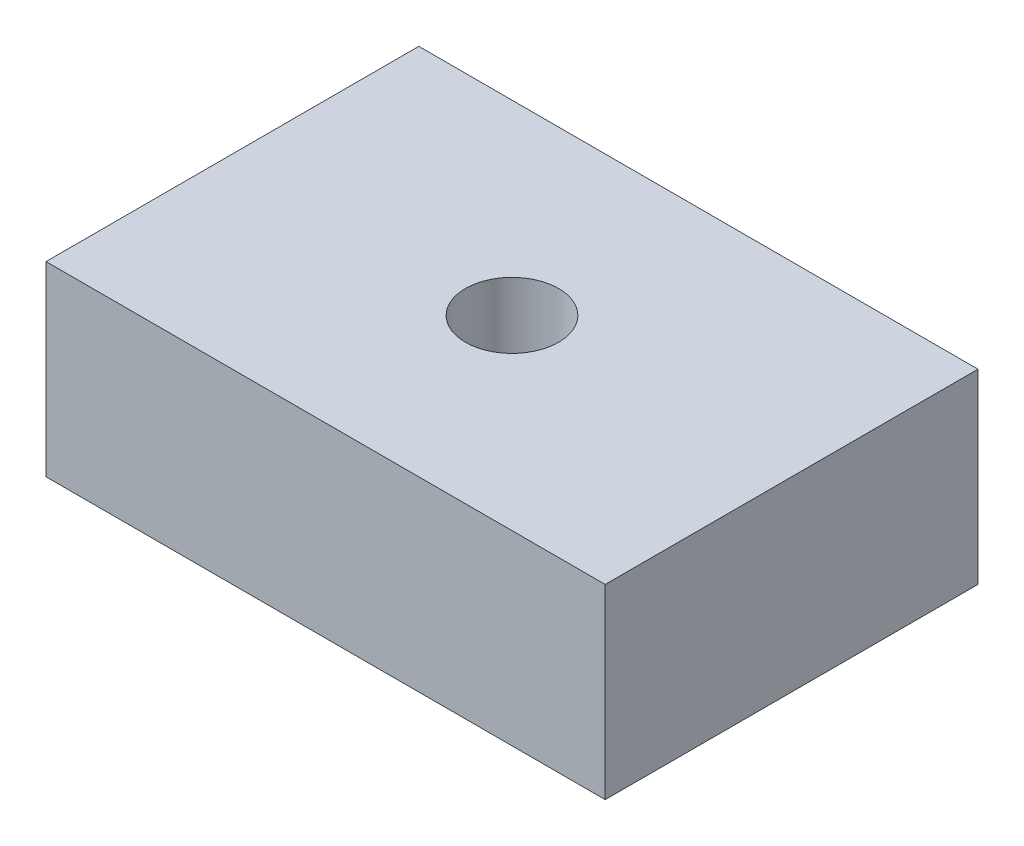
ISO-10303-21;
HEADER;
FILE_DESCRIPTION(('STEP AP214'),'2;1');
FILE_NAME('part.step','',(''),(''),'','','');
FILE_SCHEMA(('AUTOMOTIVE_DESIGN { 1 0 10303 214 1 1 1 1 }'));
ENDSEC;
DATA;
#1=APPLICATION_CONTEXT('core data for automotive mechanical design processes');
#2=APPLICATION_PROTOCOL_DEFINITION('international standard','automotive_design',2000,#1);
#3=PRODUCT_CONTEXT('',#1,'mechanical');
#4=PRODUCT('Part','Part','',(#3));
#5=PRODUCT_RELATED_PRODUCT_CATEGORY('part','',(#4));
#6=PRODUCT_DEFINITION_FORMATION('','',#4);
#7=PRODUCT_DEFINITION_CONTEXT('part definition',#1,'design');
#8=PRODUCT_DEFINITION('design','',#6,#7);
#9=PRODUCT_DEFINITION_SHAPE('','',#8);
#10=(LENGTH_UNIT() NAMED_UNIT(*) SI_UNIT(.MILLI.,.METRE.));
#11=(NAMED_UNIT(*) PLANE_ANGLE_UNIT() SI_UNIT($,.RADIAN.));
#12=(NAMED_UNIT(*) SI_UNIT($,.STERADIAN.) SOLID_ANGLE_UNIT());
#13=UNCERTAINTY_MEASURE_WITH_UNIT(LENGTH_MEASURE(1.E-05),#10,'distance_accuracy_value','');
#14=(GEOMETRIC_REPRESENTATION_CONTEXT(3) GLOBAL_UNCERTAINTY_ASSIGNED_CONTEXT((#13)) GLOBAL_UNIT_ASSIGNED_CONTEXT((#10,
#11,#12)) REPRESENTATION_CONTEXT('',''));
#15=CARTESIAN_POINT('',(0.,0.,0.));
#16=DIRECTION('',(0.,0.,1.));
#17=DIRECTION('',(1.,0.,0.));
#18=AXIS2_PLACEMENT_3D('',#15,#16,#17);
#19=CARTESIAN_POINT('',(0.,10.,0.));
#20=DIRECTION('',(0.,-1.,0.));
#21=DIRECTION('',(0.,0.,-1.));
#22=AXIS2_PLACEMENT_3D('',#19,#20,#21);
#23=PLANE('',#22);
#24=DIRECTION('',(0.,0.,-1.));
#25=VECTOR('',#24,1.);
#26=CARTESIAN_POINT('',(15.,10.,10.));
#27=LINE('',#26,#25);
#28=CARTESIAN_POINT('',(15.,10.,10.));
#29=VERTEX_POINT('',#28);
#30=CARTESIAN_POINT('',(15.,10.,-10.));
#31=VERTEX_POINT('',#30);
#32=EDGE_CURVE('E86',#29,#31,#27,.T.);
#33=ORIENTED_EDGE('',*,*,#32,.T.);
#34=DIRECTION('',(-1.,0.,0.));
#35=VECTOR('',#34,1.);
#36=CARTESIAN_POINT('',(-15.,10.,-10.));
#37=LINE('',#36,#35);
#38=CARTESIAN_POINT('',(-15.,10.,-10.));
#39=VERTEX_POINT('',#38);
#40=EDGE_CURVE('E81',#31,#39,#37,.T.);
#41=ORIENTED_EDGE('',*,*,#40,.T.);
#42=DIRECTION('',(0.,0.,1.));
#43=VECTOR('',#42,1.);
#44=CARTESIAN_POINT('',(-15.,10.,10.));
#45=LINE('',#44,#43);
#46=CARTESIAN_POINT('',(-15.,10.,10.));
#47=VERTEX_POINT('',#46);
#48=EDGE_CURVE('E84',#39,#47,#45,.T.);
#49=ORIENTED_EDGE('',*,*,#48,.T.);
#50=DIRECTION('',(1.,0.,0.));
#51=VECTOR('',#50,1.);
#52=CARTESIAN_POINT('',(-15.,10.,10.));
#53=LINE('',#52,#51);
#54=EDGE_CURVE('E51',#47,#29,#53,.T.);
#55=ORIENTED_EDGE('',*,*,#54,.T.);
#56=EDGE_LOOP('',(#33,#41,#49,#55));
#57=FACE_BOUND('',#56,.T.);
#58=CARTESIAN_POINT('',(0.,10.,0.));
#59=DIRECTION('',(0.,1.,0.));
#60=DIRECTION('',(0.,0.,1.));
#61=AXIS2_PLACEMENT_3D('',#58,#59,#60);
#62=CIRCLE('',#61,2.5);
#63=CARTESIAN_POINT('',(0.,10.,2.5));
#64=VERTEX_POINT('',#63);
#65=EDGE_CURVE('E101',#64,#64,#62,.T.);
#66=ORIENTED_EDGE('',*,*,#65,.F.);
#67=EDGE_LOOP('',(#66));
#68=FACE_BOUND('',#67,.T.);
#69=ADVANCED_FACE('F34',(#57,#68),#23,.F.);
#70=CARTESIAN_POINT('',(0.,0.,0.));
#71=DIRECTION('',(0.,-1.,0.));
#72=DIRECTION('',(0.,0.,-1.));
#73=AXIS2_PLACEMENT_3D('',#70,#71,#72);
#74=PLANE('',#73);
#75=DIRECTION('',(0.,0.,-1.));
#76=VECTOR('',#75,1.);
#77=CARTESIAN_POINT('',(15.,0.,10.));
#78=LINE('',#77,#76);
#79=CARTESIAN_POINT('',(15.,0.,10.));
#80=VERTEX_POINT('',#79);
#81=CARTESIAN_POINT('',(15.,0.,-10.));
#82=VERTEX_POINT('',#81);
#83=EDGE_CURVE('E98',#80,#82,#78,.T.);
#84=ORIENTED_EDGE('',*,*,#83,.F.);
#85=DIRECTION('',(1.,0.,0.));
#86=VECTOR('',#85,1.);
#87=CARTESIAN_POINT('',(-15.,0.,10.));
#88=LINE('',#87,#86);
#89=CARTESIAN_POINT('',(-15.,0.,10.));
#90=VERTEX_POINT('',#89);
#91=EDGE_CURVE('E74',#90,#80,#88,.T.);
#92=ORIENTED_EDGE('',*,*,#91,.F.);
#93=DIRECTION('',(0.,0.,1.));
#94=VECTOR('',#93,1.);
#95=CARTESIAN_POINT('',(-15.,0.,10.));
#96=LINE('',#95,#94);
#97=CARTESIAN_POINT('',(-15.,0.,-10.));
#98=VERTEX_POINT('',#97);
#99=EDGE_CURVE('E68',#98,#90,#96,.T.);
#100=ORIENTED_EDGE('',*,*,#99,.F.);
#101=DIRECTION('',(-1.,0.,0.));
#102=VECTOR('',#101,1.);
#103=CARTESIAN_POINT('',(-15.,0.,-10.));
#104=LINE('',#103,#102);
#105=EDGE_CURVE('E90',#82,#98,#104,.T.);
#106=ORIENTED_EDGE('',*,*,#105,.F.);
#107=EDGE_LOOP('',(#84,#92,#100,#106));
#108=FACE_BOUND('',#107,.T.);
#109=CARTESIAN_POINT('',(0.,0.,0.));
#110=DIRECTION('',(0.,1.,0.));
#111=DIRECTION('',(0.,0.,1.));
#112=AXIS2_PLACEMENT_3D('',#109,#110,#111);
#113=CIRCLE('',#112,2.5);
#114=CARTESIAN_POINT('',(0.,0.,2.5));
#115=VERTEX_POINT('',#114);
#116=EDGE_CURVE('E113',#115,#115,#113,.T.);
#117=ORIENTED_EDGE('',*,*,#116,.T.);
#118=EDGE_LOOP('',(#117));
#119=FACE_BOUND('',#118,.T.);
#120=ADVANCED_FACE('F109',(#108,#119),#74,.T.);
#121=CARTESIAN_POINT('',(15.,10.,10.));
#122=DIRECTION('',(-1.,0.,0.));
#123=DIRECTION('',(0.,0.,1.));
#124=AXIS2_PLACEMENT_3D('',#121,#122,#123);
#125=PLANE('',#124);
#126=ORIENTED_EDGE('',*,*,#83,.T.);
#127=DIRECTION('',(0.,-1.,0.));
#128=VECTOR('',#127,1.);
#129=CARTESIAN_POINT('',(15.,10.,-10.));
#130=LINE('',#129,#128);
#131=EDGE_CURVE('E11',#31,#82,#130,.T.);
#132=ORIENTED_EDGE('',*,*,#131,.F.);
#133=ORIENTED_EDGE('',*,*,#32,.F.);
#134=DIRECTION('',(0.,-1.,0.));
#135=VECTOR('',#134,1.);
#136=CARTESIAN_POINT('',(15.,10.,10.));
#137=LINE('',#136,#135);
#138=EDGE_CURVE('E94',#29,#80,#137,.T.);
#139=ORIENTED_EDGE('',*,*,#138,.T.);
#140=EDGE_LOOP('',(#126,#132,#133,#139));
#141=FACE_BOUND('',#140,.T.);
#142=ADVANCED_FACE('F36',(#141),#125,.F.);
#143=CARTESIAN_POINT('',(-15.,10.,-10.));
#144=DIRECTION('',(0.,0.,1.));
#145=DIRECTION('',(1.,0.,0.));
#146=AXIS2_PLACEMENT_3D('',#143,#144,#145);
#147=PLANE('',#146);
#148=ORIENTED_EDGE('',*,*,#105,.T.);
#149=DIRECTION('',(0.,-1.,0.));
#150=VECTOR('',#149,1.);
#151=CARTESIAN_POINT('',(-15.,10.,-10.));
#152=LINE('',#151,#150);
#153=EDGE_CURVE('E43',#39,#98,#152,.T.);
#154=ORIENTED_EDGE('',*,*,#153,.F.);
#155=ORIENTED_EDGE('',*,*,#40,.F.);
#156=ORIENTED_EDGE('',*,*,#131,.T.);
#157=EDGE_LOOP('',(#148,#154,#155,#156));
#158=FACE_BOUND('',#157,.T.);
#159=ADVANCED_FACE('F89',(#158),#147,.F.);
#160=CARTESIAN_POINT('',(-15.,10.,10.));
#161=DIRECTION('',(1.,0.,0.));
#162=DIRECTION('',(0.,0.,-1.));
#163=AXIS2_PLACEMENT_3D('',#160,#161,#162);
#164=PLANE('',#163);
#165=ORIENTED_EDGE('',*,*,#99,.T.);
#166=DIRECTION('',(0.,-1.,0.));
#167=VECTOR('',#166,1.);
#168=CARTESIAN_POINT('',(-15.,10.,10.));
#169=LINE('',#168,#167);
#170=EDGE_CURVE('E91',#47,#90,#169,.T.);
#171=ORIENTED_EDGE('',*,*,#170,.F.);
#172=ORIENTED_EDGE('',*,*,#48,.F.);
#173=ORIENTED_EDGE('',*,*,#153,.T.);
#174=EDGE_LOOP('',(#165,#171,#172,#173));
#175=FACE_BOUND('',#174,.T.);
#176=ADVANCED_FACE('F92',(#175),#164,.F.);
#177=CARTESIAN_POINT('',(-15.,10.,10.));
#178=DIRECTION('',(0.,0.,-1.));
#179=DIRECTION('',(-1.,0.,0.));
#180=AXIS2_PLACEMENT_3D('',#177,#178,#179);
#181=PLANE('',#180);
#182=ORIENTED_EDGE('',*,*,#91,.T.);
#183=ORIENTED_EDGE('',*,*,#138,.F.);
#184=ORIENTED_EDGE('',*,*,#54,.F.);
#185=ORIENTED_EDGE('',*,*,#170,.T.);
#186=EDGE_LOOP('',(#182,#183,#184,#185));
#187=FACE_BOUND('',#186,.T.);
#188=ADVANCED_FACE('F106',(#187),#181,.F.);
#189=CARTESIAN_POINT('',(0.,10.,0.));
#190=DIRECTION('',(0.,-1.,0.));
#191=DIRECTION('',(0.,0.,-1.));
#192=AXIS2_PLACEMENT_3D('',#189,#190,#191);
#193=CYLINDRICAL_SURFACE('',#192,2.5);
#194=ORIENTED_EDGE('',*,*,#65,.T.);
#195=EDGE_LOOP('',(#194));
#196=FACE_BOUND('',#195,.T.);
#197=ORIENTED_EDGE('',*,*,#116,.F.);
#198=EDGE_LOOP('',(#197));
#199=FACE_BOUND('',#198,.T.);
#200=ADVANCED_FACE('F119',(#196,#199),#193,.F.);
#201=CLOSED_SHELL('',(#69,#120,#142,#159,#176,#188,#200));
#202=MANIFOLD_SOLID_BREP('B2',#201);
#203=ADVANCED_BREP_SHAPE_REPRESENTATION('',(#18,#202),#14);
#204=SHAPE_DEFINITION_REPRESENTATION(#9,#203);
ENDSEC;
END-ISO-10303-21;
